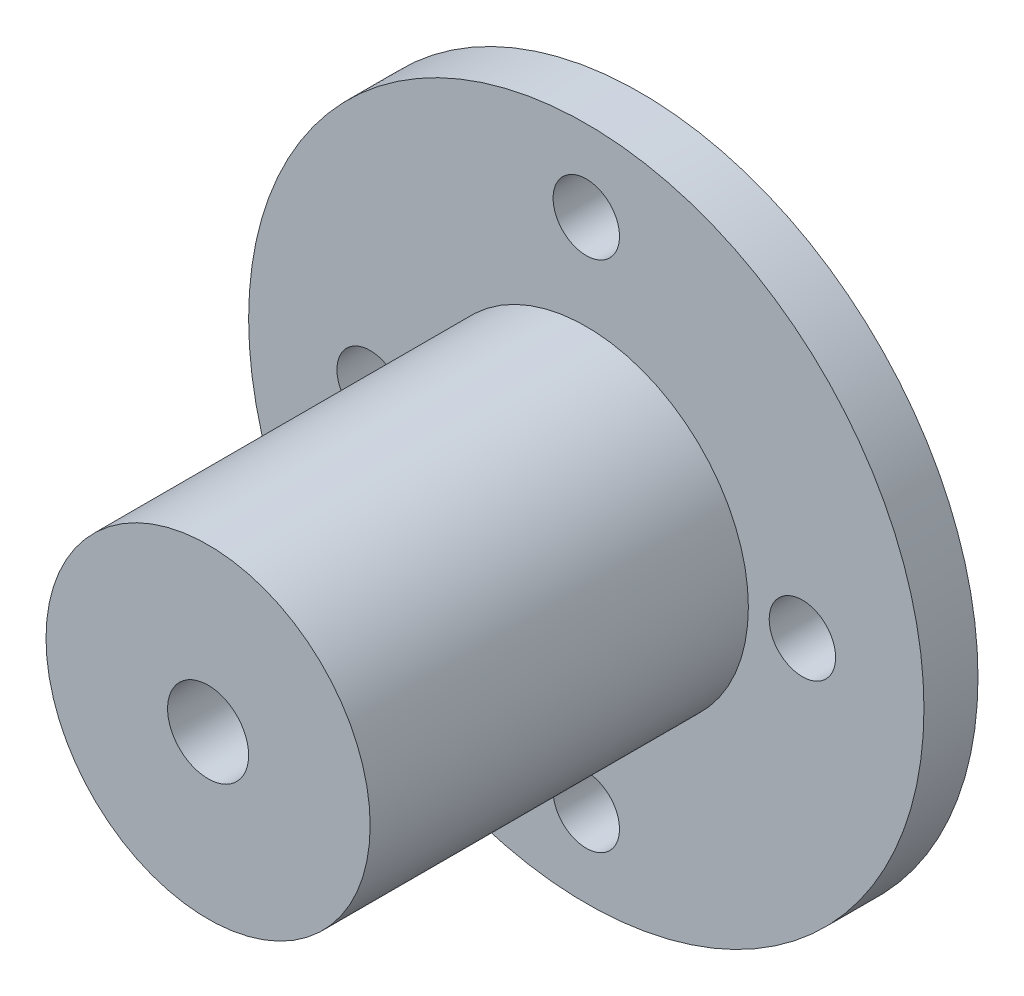
ISO-10303-21;
HEADER;
FILE_DESCRIPTION(('STEP AP214'),'2;1');
FILE_NAME('part.step','',(''),(''),'','','');
FILE_SCHEMA(('AUTOMOTIVE_DESIGN { 1 0 10303 214 1 1 1 1 }'));
ENDSEC;
DATA;
#1=APPLICATION_CONTEXT('core data for automotive mechanical design processes');
#2=APPLICATION_PROTOCOL_DEFINITION('international standard','automotive_design',2000,#1);
#3=PRODUCT_CONTEXT('',#1,'mechanical');
#4=PRODUCT('Part','Part','',(#3));
#5=PRODUCT_RELATED_PRODUCT_CATEGORY('part','',(#4));
#6=PRODUCT_DEFINITION_FORMATION('','',#4);
#7=PRODUCT_DEFINITION_CONTEXT('part definition',#1,'design');
#8=PRODUCT_DEFINITION('design','',#6,#7);
#9=PRODUCT_DEFINITION_SHAPE('','',#8);
#10=(LENGTH_UNIT() NAMED_UNIT(*) SI_UNIT(.MILLI.,.METRE.));
#11=(NAMED_UNIT(*) PLANE_ANGLE_UNIT() SI_UNIT($,.RADIAN.));
#12=(NAMED_UNIT(*) SI_UNIT($,.STERADIAN.) SOLID_ANGLE_UNIT());
#13=UNCERTAINTY_MEASURE_WITH_UNIT(LENGTH_MEASURE(1.E-05),#10,'distance_accuracy_value','');
#14=(GEOMETRIC_REPRESENTATION_CONTEXT(3) GLOBAL_UNCERTAINTY_ASSIGNED_CONTEXT((#13)) GLOBAL_UNIT_ASSIGNED_CONTEXT((#10,
#11,#12)) REPRESENTATION_CONTEXT('',''));
#15=CARTESIAN_POINT('',(0.,0.,0.));
#16=DIRECTION('',(0.,0.,1.));
#17=DIRECTION('',(1.,0.,0.));
#18=AXIS2_PLACEMENT_3D('',#15,#16,#17);
#19=CARTESIAN_POINT('',(171.170752313103,152.702756510375,21.));
#20=DIRECTION('',(0.,0.,1.));
#21=DIRECTION('',(1.,0.,0.));
#22=AXIS2_PLACEMENT_3D('',#19,#20,#21);
#23=CYLINDRICAL_SURFACE('',#22,1.5);
#24=CARTESIAN_POINT('',(171.170752313103,152.702756510375,0.));
#25=DIRECTION('',(0.,0.,1.));
#26=DIRECTION('',(1.,0.,0.));
#27=AXIS2_PLACEMENT_3D('',#24,#25,#26);
#28=CIRCLE('',#27,1.5);
#29=CARTESIAN_POINT('',(172.670752313103,152.702756510375,0.));
#30=VERTEX_POINT('',#29);
#31=EDGE_CURVE('E61',#30,#30,#28,.T.);
#32=ORIENTED_EDGE('',*,*,#31,.F.);
#33=EDGE_LOOP('',(#32));
#34=FACE_BOUND('',#33,.T.);
#35=CARTESIAN_POINT('',(171.170752313103,152.702756510375,16.));
#36=DIRECTION('',(0.,0.,1.));
#37=DIRECTION('',(1.,0.,0.));
#38=AXIS2_PLACEMENT_3D('',#35,#36,#37);
#39=CIRCLE('',#38,1.5);
#40=CARTESIAN_POINT('',(172.670752313103,152.702756510375,16.));
#41=VERTEX_POINT('',#40);
#42=EDGE_CURVE('E48',#41,#41,#39,.F.);
#43=ORIENTED_EDGE('',*,*,#42,.F.);
#44=EDGE_LOOP('',(#43));
#45=FACE_BOUND('',#44,.T.);
#46=ADVANCED_FACE('F32',(#34,#45),#23,.F.);
#47=CARTESIAN_POINT('',(171.170752313103,152.702756510375,7.));
#48=DIRECTION('',(0.,0.,1.));
#49=DIRECTION('',(1.,0.,0.));
#50=AXIS2_PLACEMENT_3D('',#47,#48,#49);
#51=CYLINDRICAL_SURFACE('',#50,6.);
#52=CARTESIAN_POINT('',(171.170752313103,152.702756510375,2.));
#53=DIRECTION('',(0.,0.,1.));
#54=DIRECTION('',(1.,0.,0.));
#55=AXIS2_PLACEMENT_3D('',#52,#53,#54);
#56=CIRCLE('',#55,6.);
#57=CARTESIAN_POINT('',(177.170752313103,152.702756510375,2.));
#58=VERTEX_POINT('',#57);
#59=EDGE_CURVE('E10',#58,#58,#56,.T.);
#60=ORIENTED_EDGE('',*,*,#59,.T.);
#61=EDGE_LOOP('',(#60));
#62=FACE_BOUND('',#61,.T.);
#63=CARTESIAN_POINT('',(171.170752313103,152.702756510375,16.));
#64=DIRECTION('',(0.,0.,1.));
#65=DIRECTION('',(1.,0.,0.));
#66=AXIS2_PLACEMENT_3D('',#63,#64,#65);
#67=CIRCLE('',#66,6.);
#68=CARTESIAN_POINT('',(177.170752313103,152.702756510375,16.));
#69=VERTEX_POINT('',#68);
#70=EDGE_CURVE('E36',#69,#69,#67,.F.);
#71=ORIENTED_EDGE('',*,*,#70,.T.);
#72=EDGE_LOOP('',(#71));
#73=FACE_BOUND('',#72,.T.);
#74=ADVANCED_FACE('F85',(#62,#73),#51,.T.);
#75=CARTESIAN_POINT('',(171.170752313103,152.702756510375,0.));
#76=DIRECTION('',(0.,0.,-1.));
#77=DIRECTION('',(-1.,0.,0.));
#78=AXIS2_PLACEMENT_3D('',#75,#76,#77);
#79=PLANE('',#78);
#80=CARTESIAN_POINT('',(171.170752313103,152.702756510375,0.));
#81=DIRECTION('',(0.,0.,1.));
#82=DIRECTION('',(1.,0.,0.));
#83=AXIS2_PLACEMENT_3D('',#80,#81,#82);
#84=CIRCLE('',#83,12.5);
#85=CARTESIAN_POINT('',(183.670752313103,152.702756510375,0.));
#86=VERTEX_POINT('',#85);
#87=EDGE_CURVE('E64',#86,#86,#84,.T.);
#88=ORIENTED_EDGE('',*,*,#87,.F.);
#89=EDGE_LOOP('',(#88));
#90=FACE_BOUND('',#89,.T.);
#91=ORIENTED_EDGE('',*,*,#31,.T.);
#92=EDGE_LOOP('',(#91));
#93=FACE_BOUND('',#92,.T.);
#94=CARTESIAN_POINT('',(171.170752313103,143.202756510374,0.));
#95=DIRECTION('',(0.,0.,-1.));
#96=DIRECTION('',(-1.,0.,0.));
#97=AXIS2_PLACEMENT_3D('',#94,#95,#96);
#98=CIRCLE('',#97,1.2295);
#99=CARTESIAN_POINT('',(169.941252313103,143.202756510374,0.));
#100=VERTEX_POINT('',#99);
#101=EDGE_CURVE('E67',#100,#100,#98,.F.);
#102=ORIENTED_EDGE('',*,*,#101,.T.);
#103=EDGE_LOOP('',(#102));
#104=FACE_BOUND('',#103,.T.);
#105=CARTESIAN_POINT('',(171.170752313103,162.202756510374,0.));
#106=DIRECTION('',(0.,0.,-1.));
#107=DIRECTION('',(-1.,0.,0.));
#108=AXIS2_PLACEMENT_3D('',#105,#106,#107);
#109=CIRCLE('',#108,1.2295);
#110=CARTESIAN_POINT('',(169.941252313103,162.202756510374,0.));
#111=VERTEX_POINT('',#110);
#112=EDGE_CURVE('E70',#111,#111,#109,.F.);
#113=ORIENTED_EDGE('',*,*,#112,.T.);
#114=EDGE_LOOP('',(#113));
#115=FACE_BOUND('',#114,.T.);
#116=CARTESIAN_POINT('',(163.170752313103,152.702756510375,0.));
#117=DIRECTION('',(0.,0.,-1.));
#118=DIRECTION('',(-1.,0.,0.));
#119=AXIS2_PLACEMENT_3D('',#116,#117,#118);
#120=CIRCLE('',#119,1.2295);
#121=CARTESIAN_POINT('',(161.941252313103,152.702756510375,0.));
#122=VERTEX_POINT('',#121);
#123=EDGE_CURVE('E73',#122,#122,#120,.F.);
#124=ORIENTED_EDGE('',*,*,#123,.T.);
#125=EDGE_LOOP('',(#124));
#126=FACE_BOUND('',#125,.T.);
#127=CARTESIAN_POINT('',(179.170752313103,152.702756510375,0.));
#128=DIRECTION('',(0.,0.,-1.));
#129=DIRECTION('',(-1.,0.,0.));
#130=AXIS2_PLACEMENT_3D('',#127,#128,#129);
#131=CIRCLE('',#130,1.2295);
#132=CARTESIAN_POINT('',(177.941252313103,152.702756510375,0.));
#133=VERTEX_POINT('',#132);
#134=EDGE_CURVE('E75',#133,#133,#131,.F.);
#135=ORIENTED_EDGE('',*,*,#134,.T.);
#136=EDGE_LOOP('',(#135));
#137=FACE_BOUND('',#136,.T.);
#138=ADVANCED_FACE('F34',(#90,#93,#104,#115,#126,#137),#79,.T.);
#139=CARTESIAN_POINT('',(179.170752313103,152.702756510375,0.));
#140=DIRECTION('',(0.,0.,-1.));
#141=DIRECTION('',(-1.,0.,0.));
#142=AXIS2_PLACEMENT_3D('',#139,#140,#141);
#143=CYLINDRICAL_SURFACE('',#142,1.2295);
#144=CARTESIAN_POINT('',(179.170752313103,152.702756510375,2.));
#145=DIRECTION('',(0.,0.,-1.));
#146=DIRECTION('',(-1.,0.,0.));
#147=AXIS2_PLACEMENT_3D('',#144,#145,#146);
#148=CIRCLE('',#147,1.2295);
#149=CARTESIAN_POINT('',(177.941252313103,152.702756510375,2.));
#150=VERTEX_POINT('',#149);
#151=EDGE_CURVE('E58',#150,#150,#148,.F.);
#152=ORIENTED_EDGE('',*,*,#151,.T.);
#153=EDGE_LOOP('',(#152));
#154=FACE_BOUND('',#153,.T.);
#155=ORIENTED_EDGE('',*,*,#134,.F.);
#156=EDGE_LOOP('',(#155));
#157=FACE_BOUND('',#156,.T.);
#158=ADVANCED_FACE('F99',(#154,#157),#143,.F.);
#159=CARTESIAN_POINT('',(163.170752313103,152.702756510375,0.));
#160=DIRECTION('',(0.,0.,-1.));
#161=DIRECTION('',(-1.,0.,0.));
#162=AXIS2_PLACEMENT_3D('',#159,#160,#161);
#163=CYLINDRICAL_SURFACE('',#162,1.2295);
#164=CARTESIAN_POINT('',(163.170752313103,152.702756510375,2.));
#165=DIRECTION('',(0.,0.,-1.));
#166=DIRECTION('',(-1.,0.,0.));
#167=AXIS2_PLACEMENT_3D('',#164,#165,#166);
#168=CIRCLE('',#167,1.2295);
#169=CARTESIAN_POINT('',(161.941252313103,152.702756510375,2.));
#170=VERTEX_POINT('',#169);
#171=EDGE_CURVE('E55',#170,#170,#168,.F.);
#172=ORIENTED_EDGE('',*,*,#171,.T.);
#173=EDGE_LOOP('',(#172));
#174=FACE_BOUND('',#173,.T.);
#175=ORIENTED_EDGE('',*,*,#123,.F.);
#176=EDGE_LOOP('',(#175));
#177=FACE_BOUND('',#176,.T.);
#178=ADVANCED_FACE('F120',(#174,#177),#163,.F.);
#179=CARTESIAN_POINT('',(171.170752313103,162.202756510374,0.));
#180=DIRECTION('',(0.,0.,-1.));
#181=DIRECTION('',(-1.,0.,0.));
#182=AXIS2_PLACEMENT_3D('',#179,#180,#181);
#183=CYLINDRICAL_SURFACE('',#182,1.2295);
#184=CARTESIAN_POINT('',(171.170752313103,162.202756510374,2.));
#185=DIRECTION('',(0.,0.,-1.));
#186=DIRECTION('',(-1.,0.,0.));
#187=AXIS2_PLACEMENT_3D('',#184,#185,#186);
#188=CIRCLE('',#187,1.2295);
#189=CARTESIAN_POINT('',(169.941252313103,162.202756510374,2.));
#190=VERTEX_POINT('',#189);
#191=EDGE_CURVE('E52',#190,#190,#188,.F.);
#192=ORIENTED_EDGE('',*,*,#191,.T.);
#193=EDGE_LOOP('',(#192));
#194=FACE_BOUND('',#193,.T.);
#195=ORIENTED_EDGE('',*,*,#112,.F.);
#196=EDGE_LOOP('',(#195));
#197=FACE_BOUND('',#196,.T.);
#198=ADVANCED_FACE('F116',(#194,#197),#183,.F.);
#199=CARTESIAN_POINT('',(171.170752313103,143.202756510374,0.));
#200=DIRECTION('',(0.,0.,-1.));
#201=DIRECTION('',(-1.,0.,0.));
#202=AXIS2_PLACEMENT_3D('',#199,#200,#201);
#203=CYLINDRICAL_SURFACE('',#202,1.2295);
#204=CARTESIAN_POINT('',(171.170752313103,143.202756510374,2.));
#205=DIRECTION('',(0.,0.,-1.));
#206=DIRECTION('',(-1.,0.,0.));
#207=AXIS2_PLACEMENT_3D('',#204,#205,#206);
#208=CIRCLE('',#207,1.2295);
#209=CARTESIAN_POINT('',(169.941252313103,143.202756510374,2.));
#210=VERTEX_POINT('',#209);
#211=EDGE_CURVE('E45',#210,#210,#208,.F.);
#212=ORIENTED_EDGE('',*,*,#211,.T.);
#213=EDGE_LOOP('',(#212));
#214=FACE_BOUND('',#213,.T.);
#215=ORIENTED_EDGE('',*,*,#101,.F.);
#216=EDGE_LOOP('',(#215));
#217=FACE_BOUND('',#216,.T.);
#218=ADVANCED_FACE('F112',(#214,#217),#203,.F.);
#219=CARTESIAN_POINT('',(171.170752313103,152.702756510375,2.));
#220=DIRECTION('',(0.,0.,1.));
#221=DIRECTION('',(1.,0.,0.));
#222=AXIS2_PLACEMENT_3D('',#219,#220,#221);
#223=CYLINDRICAL_SURFACE('',#222,12.5);
#224=ORIENTED_EDGE('',*,*,#87,.T.);
#225=EDGE_LOOP('',(#224));
#226=FACE_BOUND('',#225,.T.);
#227=CARTESIAN_POINT('',(171.170752313103,152.702756510375,2.));
#228=DIRECTION('',(0.,0.,1.));
#229=DIRECTION('',(1.,0.,0.));
#230=AXIS2_PLACEMENT_3D('',#227,#228,#229);
#231=CIRCLE('',#230,12.5);
#232=CARTESIAN_POINT('',(183.670752313103,152.702756510375,2.));
#233=VERTEX_POINT('',#232);
#234=EDGE_CURVE('E40',#233,#233,#231,.F.);
#235=ORIENTED_EDGE('',*,*,#234,.T.);
#236=EDGE_LOOP('',(#235));
#237=FACE_BOUND('',#236,.T.);
#238=ADVANCED_FACE('F94',(#226,#237),#223,.T.);
#239=CARTESIAN_POINT('',(171.170752313103,152.702756510375,2.));
#240=DIRECTION('',(0.,0.,-1.));
#241=DIRECTION('',(-1.,0.,0.));
#242=AXIS2_PLACEMENT_3D('',#239,#240,#241);
#243=PLANE('',#242);
#244=ORIENTED_EDGE('',*,*,#234,.F.);
#245=EDGE_LOOP('',(#244));
#246=FACE_BOUND('',#245,.T.);
#247=ORIENTED_EDGE('',*,*,#59,.F.);
#248=EDGE_LOOP('',(#247));
#249=FACE_BOUND('',#248,.T.);
#250=ORIENTED_EDGE('',*,*,#211,.F.);
#251=EDGE_LOOP('',(#250));
#252=FACE_BOUND('',#251,.T.);
#253=ORIENTED_EDGE('',*,*,#191,.F.);
#254=EDGE_LOOP('',(#253));
#255=FACE_BOUND('',#254,.T.);
#256=ORIENTED_EDGE('',*,*,#171,.F.);
#257=EDGE_LOOP('',(#256));
#258=FACE_BOUND('',#257,.T.);
#259=ORIENTED_EDGE('',*,*,#151,.F.);
#260=EDGE_LOOP('',(#259));
#261=FACE_BOUND('',#260,.T.);
#262=ADVANCED_FACE('F89',(#246,#249,#252,#255,#258,#261),#243,.F.);
#263=CARTESIAN_POINT('',(171.170752313103,152.702756510375,16.));
#264=DIRECTION('',(0.,0.,1.));
#265=DIRECTION('',(1.,0.,0.));
#266=AXIS2_PLACEMENT_3D('',#263,#264,#265);
#267=PLANE('',#266);
#268=ORIENTED_EDGE('',*,*,#70,.F.);
#269=EDGE_LOOP('',(#268));
#270=FACE_BOUND('',#269,.T.);
#271=ORIENTED_EDGE('',*,*,#42,.T.);
#272=EDGE_LOOP('',(#271));
#273=FACE_BOUND('',#272,.T.);
#274=ADVANCED_FACE('F87',(#270,#273),#267,.T.);
#275=CLOSED_SHELL('',(#46,#74,#138,#158,#178,#198,#218,#238,#262,#274));
#276=MANIFOLD_SOLID_BREP('B2',#275);
#277=ADVANCED_BREP_SHAPE_REPRESENTATION('',(#18,#276),#14);
#278=SHAPE_DEFINITION_REPRESENTATION(#9,#277);
ENDSEC;
END-ISO-10303-21;
